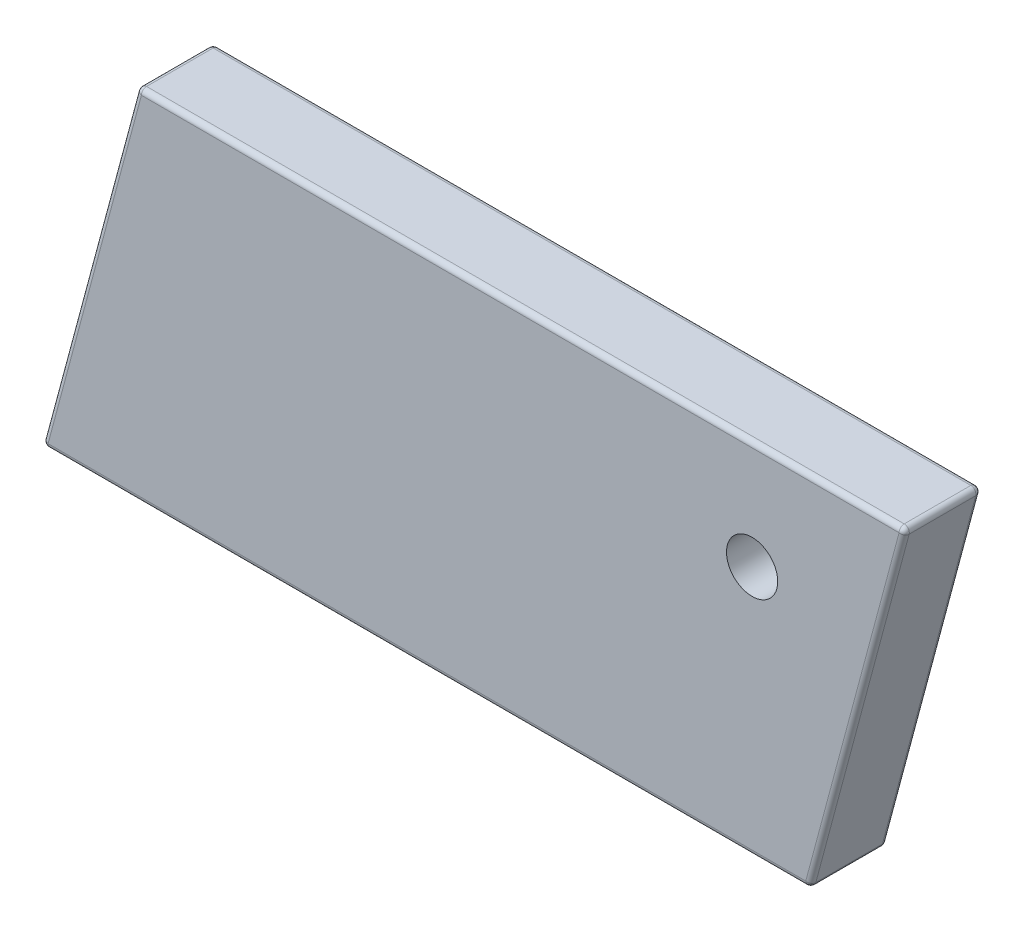
ISO-10303-21;
HEADER;
FILE_DESCRIPTION(('STEP AP214'),'2;1');
FILE_NAME('part.step','',(''),(''),'','','');
FILE_SCHEMA(('AUTOMOTIVE_DESIGN { 1 0 10303 214 1 1 1 1 }'));
ENDSEC;
DATA;
#1=APPLICATION_CONTEXT('core data for automotive mechanical design processes');
#2=APPLICATION_PROTOCOL_DEFINITION('international standard','automotive_design',2000,#1);
#3=PRODUCT_CONTEXT('',#1,'mechanical');
#4=PRODUCT('Part','Part','',(#3));
#5=PRODUCT_RELATED_PRODUCT_CATEGORY('part','',(#4));
#6=PRODUCT_DEFINITION_FORMATION('','',#4);
#7=PRODUCT_DEFINITION_CONTEXT('part definition',#1,'design');
#8=PRODUCT_DEFINITION('design','',#6,#7);
#9=PRODUCT_DEFINITION_SHAPE('','',#8);
#10=(LENGTH_UNIT() NAMED_UNIT(*) SI_UNIT(.MILLI.,.METRE.));
#11=(NAMED_UNIT(*) PLANE_ANGLE_UNIT() SI_UNIT($,.RADIAN.));
#12=(NAMED_UNIT(*) SI_UNIT($,.STERADIAN.) SOLID_ANGLE_UNIT());
#13=UNCERTAINTY_MEASURE_WITH_UNIT(LENGTH_MEASURE(1.E-05),#10,'distance_accuracy_value','');
#14=(GEOMETRIC_REPRESENTATION_CONTEXT(3) GLOBAL_UNCERTAINTY_ASSIGNED_CONTEXT((#13)) GLOBAL_UNIT_ASSIGNED_CONTEXT((#10,
#11,#12)) REPRESENTATION_CONTEXT('',''));
#15=CARTESIAN_POINT('',(0.,0.,0.));
#16=DIRECTION('',(0.,0.,1.));
#17=DIRECTION('',(1.,0.,0.));
#18=AXIS2_PLACEMENT_3D('',#15,#16,#17);
#19=CARTESIAN_POINT('',(190.5,0.,19.05));
#20=DIRECTION('',(0.,1.,0.));
#21=DIRECTION('',(0.,0.,1.));
#22=AXIS2_PLACEMENT_3D('',#19,#20,#21);
#23=PLANE('',#22);
#24=DIRECTION('',(1.,0.,0.));
#25=VECTOR('',#24,1.);
#26=CARTESIAN_POINT('',(190.5,0.,1.27));
#27=LINE('',#26,#25);
#28=CARTESIAN_POINT('',(1.65509622350835,0.,1.27));
#29=VERTEX_POINT('',#28);
#30=CARTESIAN_POINT('',(189.525494725267,0.,1.27));
#31=VERTEX_POINT('',#30);
#32=EDGE_CURVE('E250',#29,#31,#27,.T.);
#33=ORIENTED_EDGE('',*,*,#32,.T.);
#34=DIRECTION('',(0.,0.,-1.));
#35=VECTOR('',#34,1.);
#36=CARTESIAN_POINT('',(189.525494725267,0.,19.05));
#37=LINE('',#36,#35);
#38=CARTESIAN_POINT('',(189.525494725267,0.,17.78));
#39=VERTEX_POINT('',#38);
#40=EDGE_CURVE('E257',#31,#39,#37,.F.);
#41=ORIENTED_EDGE('',*,*,#40,.T.);
#42=DIRECTION('',(1.,0.,0.));
#43=VECTOR('',#42,1.);
#44=CARTESIAN_POINT('',(190.5,0.,17.78));
#45=LINE('',#44,#43);
#46=CARTESIAN_POINT('',(1.65509622350835,0.,17.78));
#47=VERTEX_POINT('',#46);
#48=EDGE_CURVE('E253',#39,#47,#45,.F.);
#49=ORIENTED_EDGE('',*,*,#48,.T.);
#50=DIRECTION('',(0.,0.,-1.));
#51=VECTOR('',#50,1.);
#52=CARTESIAN_POINT('',(1.65509622350835,0.,19.05));
#53=LINE('',#52,#51);
#54=EDGE_CURVE('E247',#47,#29,#53,.T.);
#55=ORIENTED_EDGE('',*,*,#54,.T.);
#56=EDGE_LOOP('',(#33,#41,#49,#55));
#57=FACE_BOUND('',#56,.T.);
#58=ADVANCED_FACE('F39',(#57),#23,.F.);
#59=CARTESIAN_POINT('',(214.320683207127,88.9,19.05));
#60=DIRECTION('',(-0.965925826289067,0.258819045102524,0.));
#61=DIRECTION('',(-0.258819045102524,-0.965925826289068,0.));
#62=AXIS2_PLACEMENT_3D('',#59,#60,#61);
#63=PLANE('',#62);
#64=DIRECTION('',(0.258819045102524,0.965925826289068,0.));
#65=VECTOR('',#64,1.);
#66=CARTESIAN_POINT('',(214.320683207127,88.9,17.78));
#67=LINE('',#66,#65);
#68=CARTESIAN_POINT('',(213.892312783006,87.3012998127198,17.78));
#69=VERTEX_POINT('',#68);
#70=CARTESIAN_POINT('',(190.752220524654,0.941299812719789,17.78));
#71=VERTEX_POINT('',#70);
#72=EDGE_CURVE('E165',#69,#71,#67,.F.);
#73=ORIENTED_EDGE('',*,*,#72,.T.);
#74=DIRECTION('',(0.,0.,-1.));
#75=VECTOR('',#74,1.);
#76=CARTESIAN_POINT('',(190.752220524654,0.941299812719787,19.05));
#77=LINE('',#76,#75);
#78=CARTESIAN_POINT('',(190.752220524654,0.941299812719789,1.27));
#79=VERTEX_POINT('',#78);
#80=EDGE_CURVE('E281',#71,#79,#77,.T.);
#81=ORIENTED_EDGE('',*,*,#80,.T.);
#82=DIRECTION('',(0.258819045102524,0.965925826289068,0.));
#83=VECTOR('',#82,1.);
#84=CARTESIAN_POINT('',(214.320683207127,88.9,1.27));
#85=LINE('',#84,#83);
#86=CARTESIAN_POINT('',(213.892312783006,87.3012998127198,1.27));
#87=VERTEX_POINT('',#86);
#88=EDGE_CURVE('E273',#79,#87,#85,.T.);
#89=ORIENTED_EDGE('',*,*,#88,.T.);
#90=DIRECTION('',(0.,0.,-1.));
#91=VECTOR('',#90,1.);
#92=CARTESIAN_POINT('',(213.892312783006,87.3012998127198,19.05));
#93=LINE('',#92,#91);
#94=EDGE_CURVE('E276',#87,#69,#93,.F.);
#95=ORIENTED_EDGE('',*,*,#94,.T.);
#96=EDGE_LOOP('',(#73,#81,#89,#95));
#97=FACE_BOUND('',#96,.T.);
#98=ADVANCED_FACE('F348',(#97),#63,.F.);
#99=CARTESIAN_POINT('',(23.8206832071271,88.9,19.05));
#100=DIRECTION('',(0.,-1.,0.));
#101=DIRECTION('',(1.,0.,0.));
#102=AXIS2_PLACEMENT_3D('',#99,#100,#101);
#103=PLANE('',#102);
#104=DIRECTION('',(0.,0.,-1.));
#105=VECTOR('',#104,1.);
#106=CARTESIAN_POINT('',(212.665586983619,88.9,19.05));
#107=LINE('',#106,#105);
#108=CARTESIAN_POINT('',(212.665586983619,88.9,17.78));
#109=VERTEX_POINT('',#108);
#110=CARTESIAN_POINT('',(212.665586983619,88.9,1.27));
#111=VERTEX_POINT('',#110);
#112=EDGE_CURVE('E291',#109,#111,#107,.T.);
#113=ORIENTED_EDGE('',*,*,#112,.T.);
#114=DIRECTION('',(-1.,0.,0.));
#115=VECTOR('',#114,1.);
#116=CARTESIAN_POINT('',(23.8206832071271,88.9,1.27));
#117=LINE('',#116,#115);
#118=CARTESIAN_POINT('',(24.7951884818604,88.9,1.27));
#119=VERTEX_POINT('',#118);
#120=EDGE_CURVE('E295',#111,#119,#117,.T.);
#121=ORIENTED_EDGE('',*,*,#120,.T.);
#122=DIRECTION('',(0.,0.,-1.));
#123=VECTOR('',#122,1.);
#124=CARTESIAN_POINT('',(24.7951884818604,88.9,19.05));
#125=LINE('',#124,#123);
#126=CARTESIAN_POINT('',(24.7951884818604,88.9,17.78));
#127=VERTEX_POINT('',#126);
#128=EDGE_CURVE('E288',#119,#127,#125,.F.);
#129=ORIENTED_EDGE('',*,*,#128,.T.);
#130=DIRECTION('',(-1.,0.,0.));
#131=VECTOR('',#130,1.);
#132=CARTESIAN_POINT('',(23.8206832071271,88.9,17.78));
#133=LINE('',#132,#131);
#134=EDGE_CURVE('E285',#127,#109,#133,.F.);
#135=ORIENTED_EDGE('',*,*,#134,.T.);
#136=EDGE_LOOP('',(#113,#121,#129,#135));
#137=FACE_BOUND('',#136,.T.);
#138=ADVANCED_FACE('F355',(#137),#103,.F.);
#139=CARTESIAN_POINT('',(0.,0.,19.05));
#140=DIRECTION('',(0.965925826289067,-0.258819045102524,0.));
#141=DIRECTION('',(0.258819045102524,0.965925826289068,0.));
#142=AXIS2_PLACEMENT_3D('',#139,#140,#141);
#143=PLANE('',#142);
#144=DIRECTION('',(-0.258819045102524,-0.965925826289068,0.));
#145=VECTOR('',#144,1.);
#146=CARTESIAN_POINT('',(0.,0.,17.78));
#147=LINE('',#146,#145);
#148=CARTESIAN_POINT('',(0.428370424121223,1.59870018728021,17.78));
#149=VERTEX_POINT('',#148);
#150=CARTESIAN_POINT('',(23.5684626824733,87.9587001872802,17.78));
#151=VERTEX_POINT('',#150);
#152=EDGE_CURVE('E49',#149,#151,#147,.F.);
#153=ORIENTED_EDGE('',*,*,#152,.T.);
#154=DIRECTION('',(0.,0.,-1.));
#155=VECTOR('',#154,1.);
#156=CARTESIAN_POINT('',(23.5684626824733,87.9587001872802,19.05));
#157=LINE('',#156,#155);
#158=CARTESIAN_POINT('',(23.5684626824733,87.9587001872802,1.27));
#159=VERTEX_POINT('',#158);
#160=EDGE_CURVE('E11',#151,#159,#157,.T.);
#161=ORIENTED_EDGE('',*,*,#160,.T.);
#162=DIRECTION('',(-0.258819045102524,-0.965925826289068,0.));
#163=VECTOR('',#162,1.);
#164=CARTESIAN_POINT('',(0.,0.,1.27));
#165=LINE('',#164,#163);
#166=CARTESIAN_POINT('',(0.428370424121223,1.59870018728021,1.27));
#167=VERTEX_POINT('',#166);
#168=EDGE_CURVE('E298',#159,#167,#165,.T.);
#169=ORIENTED_EDGE('',*,*,#168,.T.);
#170=DIRECTION('',(0.,0.,-1.));
#171=VECTOR('',#170,1.);
#172=CARTESIAN_POINT('',(0.428370424121223,1.59870018728021,19.05));
#173=LINE('',#172,#171);
#174=EDGE_CURVE('E60',#167,#149,#173,.F.);
#175=ORIENTED_EDGE('',*,*,#174,.T.);
#176=EDGE_LOOP('',(#153,#161,#169,#175));
#177=FACE_BOUND('',#176,.T.);
#178=ADVANCED_FACE('F553',(#177),#143,.F.);
#179=CARTESIAN_POINT('',(0.,0.,19.05));
#180=DIRECTION('',(0.,0.,-1.));
#181=DIRECTION('',(-1.,0.,0.));
#182=AXIS2_PLACEMENT_3D('',#179,#180,#181);
#183=PLANE('',#182);
#184=DIRECTION('',(-0.258819045102524,-0.965925826289068,0.));
#185=VECTOR('',#184,1.);
#186=CARTESIAN_POINT('',(1.22672579938712,-0.328700187280206,19.05));
#187=LINE('',#186,#185);
#188=CARTESIAN_POINT('',(24.7951884818604,87.63,19.05));
#189=VERTEX_POINT('',#188);
#190=CARTESIAN_POINT('',(1.65509622350834,1.27,19.05));
#191=VERTEX_POINT('',#190);
#192=EDGE_CURVE('E140',#189,#191,#187,.T.);
#193=ORIENTED_EDGE('',*,*,#192,.T.);
#194=DIRECTION('',(1.,0.,0.));
#195=VECTOR('',#194,1.);
#196=CARTESIAN_POINT('',(0.,1.27,19.05));
#197=LINE('',#196,#195);
#198=CARTESIAN_POINT('',(189.525494725267,1.27,19.05));
#199=VERTEX_POINT('',#198);
#200=EDGE_CURVE('E135',#191,#199,#197,.T.);
#201=ORIENTED_EDGE('',*,*,#200,.T.);
#202=DIRECTION('',(0.258819045102524,0.965925826289068,0.));
#203=VECTOR('',#202,1.);
#204=CARTESIAN_POINT('',(176.51219391108,-47.2962998127204,19.05));
#205=LINE('',#204,#203);
#206=CARTESIAN_POINT('',(212.665586983619,87.63,19.05));
#207=VERTEX_POINT('',#206);
#208=EDGE_CURVE('E128',#199,#207,#205,.T.);
#209=ORIENTED_EDGE('',*,*,#208,.T.);
#210=DIRECTION('',(-1.,0.,0.));
#211=VECTOR('',#210,1.);
#212=CARTESIAN_POINT('',(0.,87.63,19.05));
#213=LINE('',#212,#211);
#214=EDGE_CURVE('E132',#207,#189,#213,.T.);
#215=ORIENTED_EDGE('',*,*,#214,.T.);
#216=EDGE_LOOP('',(#193,#201,#209,#215));
#217=FACE_BOUND('',#216,.T.);
#218=CARTESIAN_POINT('',(176.220683207127,62.0837890126232,19.05));
#219=DIRECTION('',(0.,0.,1.));
#220=DIRECTION('',(1.,0.,0.));
#221=AXIS2_PLACEMENT_3D('',#218,#219,#220);
#222=CIRCLE('',#221,6.34999999999999);
#223=CARTESIAN_POINT('',(182.570683207127,62.0837890126232,19.05));
#224=VERTEX_POINT('',#223);
#225=EDGE_CURVE('E229',#224,#224,#222,.T.);
#226=ORIENTED_EDGE('',*,*,#225,.F.);
#227=EDGE_LOOP('',(#226));
#228=FACE_BOUND('',#227,.T.);
#229=ADVANCED_FACE('F130',(#217,#228),#183,.F.);
#230=CARTESIAN_POINT('',(0.,0.,0.));
#231=DIRECTION('',(0.,0.,-1.));
#232=DIRECTION('',(-1.,0.,0.));
#233=AXIS2_PLACEMENT_3D('',#230,#231,#232);
#234=PLANE('',#233);
#235=DIRECTION('',(0.258819045102524,0.965925826289068,0.));
#236=VECTOR('',#235,1.);
#237=CARTESIAN_POINT('',(189.273274200613,0.328700187280165,0.));
#238=LINE('',#237,#236);
#239=CARTESIAN_POINT('',(212.665586983619,87.63,0.));
#240=VERTEX_POINT('',#239);
#241=CARTESIAN_POINT('',(189.525494725267,1.27,0.));
#242=VERTEX_POINT('',#241);
#243=EDGE_CURVE('E266',#240,#242,#238,.F.);
#244=ORIENTED_EDGE('',*,*,#243,.T.);
#245=DIRECTION('',(1.,0.,0.));
#246=VECTOR('',#245,1.);
#247=CARTESIAN_POINT('',(0.,1.27,0.));
#248=LINE('',#247,#246);
#249=CARTESIAN_POINT('',(1.65509622350834,1.27,0.));
#250=VERTEX_POINT('',#249);
#251=EDGE_CURVE('E269',#242,#250,#248,.F.);
#252=ORIENTED_EDGE('',*,*,#251,.T.);
#253=DIRECTION('',(-0.258819045102524,-0.965925826289068,0.));
#254=VECTOR('',#253,1.);
#255=CARTESIAN_POINT('',(25.0474090065143,88.5712998127198,0.));
#256=LINE('',#255,#254);
#257=CARTESIAN_POINT('',(24.7951884818604,87.63,0.));
#258=VERTEX_POINT('',#257);
#259=EDGE_CURVE('E263',#250,#258,#256,.F.);
#260=ORIENTED_EDGE('',*,*,#259,.T.);
#261=DIRECTION('',(-1.,0.,0.));
#262=VECTOR('',#261,1.);
#263=CARTESIAN_POINT('',(214.320683207127,87.63,0.));
#264=LINE('',#263,#262);
#265=EDGE_CURVE('E260',#258,#240,#264,.F.);
#266=ORIENTED_EDGE('',*,*,#265,.T.);
#267=EDGE_LOOP('',(#244,#252,#260,#266));
#268=FACE_BOUND('',#267,.T.);
#269=CARTESIAN_POINT('',(176.220683207127,62.0837890126232,0.));
#270=DIRECTION('',(0.,0.,1.));
#271=DIRECTION('',(1.,0.,0.));
#272=AXIS2_PLACEMENT_3D('',#269,#270,#271);
#273=CIRCLE('',#272,6.34999999999999);
#274=CARTESIAN_POINT('',(182.570683207127,62.0837890126232,0.));
#275=VERTEX_POINT('',#274);
#276=EDGE_CURVE('E153',#275,#275,#273,.T.);
#277=ORIENTED_EDGE('',*,*,#276,.T.);
#278=EDGE_LOOP('',(#277));
#279=FACE_BOUND('',#278,.T.);
#280=ADVANCED_FACE('F537',(#268,#279),#234,.T.);
#281=CARTESIAN_POINT('',(176.220683207127,62.0837890126232,0.));
#282=DIRECTION('',(0.,0.,1.));
#283=DIRECTION('',(1.,0.,0.));
#284=AXIS2_PLACEMENT_3D('',#281,#282,#283);
#285=CYLINDRICAL_SURFACE('',#284,6.34999999999999);
#286=CARTESIAN_POINT('',(182.570683207127,62.0837890126232,0.));
#287=CARTESIAN_POINT('',(182.570683207127,62.0837890126232,0.1984375));
#288=CARTESIAN_POINT('',(182.570683207127,62.0837890126232,0.396875));
#289=CARTESIAN_POINT('',(182.570683207127,62.0837890126232,0.79375));
#290=CARTESIAN_POINT('',(182.570683207127,62.0837890126232,0.9921875));
#291=CARTESIAN_POINT('',(182.570683207127,62.0837890126232,1.3890625));
#292=CARTESIAN_POINT('',(182.570683207127,62.0837890126232,1.5875));
#293=CARTESIAN_POINT('',(182.570683207127,62.0837890126232,1.984375));
#294=CARTESIAN_POINT('',(182.570683207127,62.0837890126232,2.1828125));
#295=CARTESIAN_POINT('',(182.570683207127,62.0837890126232,2.5796875));
#296=CARTESIAN_POINT('',(182.570683207127,62.0837890126232,2.778125));
#297=CARTESIAN_POINT('',(182.570683207127,62.0837890126232,3.175));
#298=CARTESIAN_POINT('',(182.570683207127,62.0837890126232,3.3734375));
#299=CARTESIAN_POINT('',(182.570683207127,62.0837890126232,3.7703125));
#300=CARTESIAN_POINT('',(182.570683207127,62.0837890126232,3.96875));
#301=CARTESIAN_POINT('',(182.570683207127,62.0837890126232,4.365625));
#302=CARTESIAN_POINT('',(182.570683207127,62.0837890126232,4.5640625));
#303=CARTESIAN_POINT('',(182.570683207127,62.0837890126232,4.9609375));
#304=CARTESIAN_POINT('',(182.570683207127,62.0837890126232,5.159375));
#305=CARTESIAN_POINT('',(182.570683207127,62.0837890126232,5.55625));
#306=CARTESIAN_POINT('',(182.570683207127,62.0837890126232,5.7546875));
#307=CARTESIAN_POINT('',(182.570683207127,62.0837890126232,6.1515625));
#308=CARTESIAN_POINT('',(182.570683207127,62.0837890126232,6.35));
#309=CARTESIAN_POINT('',(182.570683207127,62.0837890126232,6.746875));
#310=CARTESIAN_POINT('',(182.570683207127,62.0837890126232,6.9453125));
#311=CARTESIAN_POINT('',(182.570683207127,62.0837890126232,7.3421875));
#312=CARTESIAN_POINT('',(182.570683207127,62.0837890126232,7.540625));
#313=CARTESIAN_POINT('',(182.570683207127,62.0837890126232,7.9375));
#314=CARTESIAN_POINT('',(182.570683207127,62.0837890126232,8.1359375));
#315=CARTESIAN_POINT('',(182.570683207127,62.0837890126232,8.5328125));
#316=CARTESIAN_POINT('',(182.570683207127,62.0837890126232,8.73125));
#317=CARTESIAN_POINT('',(182.570683207127,62.0837890126232,9.128125));
#318=CARTESIAN_POINT('',(182.570683207127,62.0837890126232,9.3265625));
#319=CARTESIAN_POINT('',(182.570683207127,62.0837890126232,9.7234375));
#320=CARTESIAN_POINT('',(182.570683207127,62.0837890126232,9.921875));
#321=CARTESIAN_POINT('',(182.570683207127,62.0837890126232,10.31875));
#322=CARTESIAN_POINT('',(182.570683207127,62.0837890126232,10.5171875));
#323=CARTESIAN_POINT('',(182.570683207127,62.0837890126232,10.9140625));
#324=CARTESIAN_POINT('',(182.570683207127,62.0837890126232,11.1125));
#325=CARTESIAN_POINT('',(182.570683207127,62.0837890126232,11.509375));
#326=CARTESIAN_POINT('',(182.570683207127,62.0837890126232,11.7078125));
#327=CARTESIAN_POINT('',(182.570683207127,62.0837890126232,12.1046875));
#328=CARTESIAN_POINT('',(182.570683207127,62.0837890126232,12.303125));
#329=CARTESIAN_POINT('',(182.570683207127,62.0837890126232,12.7));
#330=CARTESIAN_POINT('',(182.570683207127,62.0837890126232,12.8984375));
#331=CARTESIAN_POINT('',(182.570683207127,62.0837890126232,13.2953125));
#332=CARTESIAN_POINT('',(182.570683207127,62.0837890126232,13.49375));
#333=CARTESIAN_POINT('',(182.570683207127,62.0837890126232,13.890625));
#334=CARTESIAN_POINT('',(182.570683207127,62.0837890126232,14.0890625));
#335=CARTESIAN_POINT('',(182.570683207127,62.0837890126232,14.4859375));
#336=CARTESIAN_POINT('',(182.570683207127,62.0837890126232,14.684375));
#337=CARTESIAN_POINT('',(182.570683207127,62.0837890126232,15.08125));
#338=CARTESIAN_POINT('',(182.570683207127,62.0837890126232,15.2796875));
#339=CARTESIAN_POINT('',(182.570683207127,62.0837890126232,15.6765625));
#340=CARTESIAN_POINT('',(182.570683207127,62.0837890126232,15.875));
#341=CARTESIAN_POINT('',(182.570683207127,62.0837890126232,16.271875));
#342=CARTESIAN_POINT('',(182.570683207127,62.0837890126232,16.4703125));
#343=CARTESIAN_POINT('',(182.570683207127,62.0837890126232,16.8671875));
#344=CARTESIAN_POINT('',(182.570683207127,62.0837890126232,17.065625));
#345=CARTESIAN_POINT('',(182.570683207127,62.0837890126232,17.4625));
#346=CARTESIAN_POINT('',(182.570683207127,62.0837890126232,17.6609375));
#347=CARTESIAN_POINT('',(182.570683207127,62.0837890126232,18.0578125));
#348=CARTESIAN_POINT('',(182.570683207127,62.0837890126232,18.25625));
#349=CARTESIAN_POINT('',(182.570683207127,62.0837890126232,18.653125));
#350=CARTESIAN_POINT('',(182.570683207127,62.0837890126232,18.8515625));
#351=CARTESIAN_POINT('',(182.570683207127,62.0837890126232,19.05));
#352=B_SPLINE_CURVE_WITH_KNOTS('',3,(#286,#287,#288,#289,#290,#291,#292,#293,#294,#295,#296,
#297,#298,#299,#300,#301,#302,#303,#304,#305,#306,#307,#308,#309,#310,#311,#312,#313,#314,#315,
#316,#317,#318,#319,#320,#321,#322,#323,#324,#325,#326,#327,#328,#329,#330,#331,#332,#333,#334,
#335,#336,#337,#338,#339,#340,#341,#342,#343,#344,#345,#346,#347,#348,#349,#350,#351),
.UNSPECIFIED.,.F.,.F.,(4,2,2,2,2,2,2,2,2,2,2,2,2,2,2,2,2,2,2,2,2,2,2,2,2,2,2,2,2,2,2,2,4),(0.,
0.5953125,1.190625,1.7859375,2.38125,2.9765625,3.571875,4.1671875,4.7625,5.3578125,5.953125,
6.5484375,7.14375,7.7390625,8.334375,8.9296875,9.525,10.1203125,10.715625,11.3109375,11.90625,
12.5015625,13.096875,13.6921875,14.2875,14.8828125,15.478125,16.0734375,16.66875,17.2640625,
17.859375,18.4546875,19.05),.UNSPECIFIED.);
#353=EDGE_CURVE('BSEAM528',#275,#224,#352,.T.);
#354=ORIENTED_EDGE('',*,*,#276,.F.);
#355=ORIENTED_EDGE('',*,*,#225,.T.);
#356=ORIENTED_EDGE('',*,*,#353,.T.);
#357=ORIENTED_EDGE('',*,*,#353,.F.);
#358=EDGE_LOOP('',(#354,#356,#355,#357));
#359=FACE_BOUND('',#358,.T.);
#360=ADVANCED_FACE('F528',(#359),#285,.F.);
#361=CARTESIAN_POINT('',(23.8206832071271,87.63,1.27));
#362=DIRECTION('',(1.,0.,0.));
#363=DIRECTION('',(0.,1.,0.));
#364=AXIS2_PLACEMENT_3D('',#361,#362,#363);
#365=CYLINDRICAL_SURFACE('',#364,1.27);
#366=CARTESIAN_POINT('',(24.7951884818604,87.63,1.27));
#367=DIRECTION('',(-1.,0.,0.));
#368=DIRECTION('',(0.,0.,1.));
#369=AXIS2_PLACEMENT_3D('',#366,#367,#368);
#370=CIRCLE('',#369,1.27);
#371=EDGE_CURVE('E43',#119,#258,#370,.T.);
#372=ORIENTED_EDGE('',*,*,#371,.F.);
#373=ORIENTED_EDGE('',*,*,#120,.F.);
#374=CARTESIAN_POINT('',(212.665586983619,87.63,1.27));
#375=DIRECTION('',(1.,0.,0.));
#376=DIRECTION('',(0.,1.,0.));
#377=AXIS2_PLACEMENT_3D('',#374,#375,#376);
#378=CIRCLE('',#377,1.27);
#379=EDGE_CURVE('E219',#240,#111,#378,.T.);
#380=ORIENTED_EDGE('',*,*,#379,.F.);
#381=ORIENTED_EDGE('',*,*,#265,.F.);
#382=EDGE_LOOP('',(#372,#373,#380,#381));
#383=FACE_BOUND('',#382,.T.);
#384=ADVANCED_FACE('F41',(#383),#365,.T.);
#385=CARTESIAN_POINT('',(24.7951884818604,87.63,1.27));
#386=DIRECTION('',(0.,0.,1.));
#387=DIRECTION('',(1.,0.,0.));
#388=AXIS2_PLACEMENT_3D('',#385,#386,#387);
#389=SPHERICAL_SURFACE('',#388,1.27);
#390=CARTESIAN_POINT('',(24.7951884818604,87.63,1.27));
#391=DIRECTION('',(0.,0.,-1.));
#392=DIRECTION('',(-1.,0.,0.));
#393=AXIS2_PLACEMENT_3D('',#390,#391,#392);
#394=CIRCLE('',#393,1.27);
#395=EDGE_CURVE('E212',#119,#159,#394,.F.);
#396=ORIENTED_EDGE('',*,*,#395,.F.);
#397=ORIENTED_EDGE('',*,*,#371,.T.);
#398=CARTESIAN_POINT('',(24.7951884818604,87.63,1.27));
#399=DIRECTION('',(0.258819045102535,0.965925826289064,0.));
#400=DIRECTION('',(-0.965925826289064,0.258819045102535,0.));
#401=AXIS2_PLACEMENT_3D('',#398,#399,#400);
#402=CIRCLE('',#401,1.27);
#403=EDGE_CURVE('E216',#159,#258,#402,.F.);
#404=ORIENTED_EDGE('',*,*,#403,.F.);
#405=EDGE_LOOP('',(#396,#397,#404));
#406=FACE_BOUND('',#405,.T.);
#407=ADVANCED_FACE('F514',(#406),#389,.T.);
#408=CARTESIAN_POINT('',(212.665586983619,87.63,1.27));
#409=DIRECTION('',(0.,0.,1.));
#410=DIRECTION('',(1.,0.,0.));
#411=AXIS2_PLACEMENT_3D('',#408,#409,#410);
#412=SPHERICAL_SURFACE('',#411,1.27);
#413=CARTESIAN_POINT('',(212.665586983619,87.63,1.27));
#414=DIRECTION('',(0.258819045102523,0.965925826289068,0.));
#415=DIRECTION('',(-0.965925826289068,0.258819045102523,0.));
#416=AXIS2_PLACEMENT_3D('',#413,#414,#415);
#417=CIRCLE('',#416,1.27);
#418=EDGE_CURVE('E205',#240,#87,#417,.F.);
#419=ORIENTED_EDGE('',*,*,#418,.F.);
#420=ORIENTED_EDGE('',*,*,#379,.T.);
#421=CARTESIAN_POINT('',(212.665586983619,87.63,1.27));
#422=DIRECTION('',(0.,0.,-1.));
#423=DIRECTION('',(-1.,0.,0.));
#424=AXIS2_PLACEMENT_3D('',#421,#422,#423);
#425=CIRCLE('',#424,1.27);
#426=EDGE_CURVE('E209',#87,#111,#425,.F.);
#427=ORIENTED_EDGE('',*,*,#426,.F.);
#428=EDGE_LOOP('',(#419,#420,#427));
#429=FACE_BOUND('',#428,.T.);
#430=ADVANCED_FACE('F505',(#429),#412,.T.);
#431=CARTESIAN_POINT('',(1.22672579938712,-0.328700187280206,1.27));
#432=DIRECTION('',(0.258819045102524,0.965925826289068,0.));
#433=DIRECTION('',(-0.965925826289067,0.258819045102524,0.));
#434=AXIS2_PLACEMENT_3D('',#431,#432,#433);
#435=CYLINDRICAL_SURFACE('',#434,1.27);
#436=ORIENTED_EDGE('',*,*,#403,.T.);
#437=ORIENTED_EDGE('',*,*,#259,.F.);
#438=CARTESIAN_POINT('',(1.65509622350834,1.27,1.27));
#439=DIRECTION('',(-0.258819045102524,-0.965925826289067,0.));
#440=DIRECTION('',(0.965925826289067,-0.258819045102524,0.));
#441=AXIS2_PLACEMENT_3D('',#438,#439,#440);
#442=CIRCLE('',#441,1.27);
#443=EDGE_CURVE('E198',#167,#250,#442,.T.);
#444=ORIENTED_EDGE('',*,*,#443,.F.);
#445=ORIENTED_EDGE('',*,*,#168,.F.);
#446=EDGE_LOOP('',(#436,#437,#444,#445));
#447=FACE_BOUND('',#446,.T.);
#448=ADVANCED_FACE('F497',(#447),#435,.T.);
#449=CARTESIAN_POINT('',(24.7951884818604,87.63,19.05));
#450=DIRECTION('',(0.,0.,-1.));
#451=DIRECTION('',(-1.,0.,0.));
#452=AXIS2_PLACEMENT_3D('',#449,#450,#451);
#453=CYLINDRICAL_SURFACE('',#452,1.27);
#454=ORIENTED_EDGE('',*,*,#395,.T.);
#455=ORIENTED_EDGE('',*,*,#160,.F.);
#456=CARTESIAN_POINT('',(24.7951884818604,87.63,17.78));
#457=DIRECTION('',(0.,0.,1.));
#458=DIRECTION('',(1.,0.,0.));
#459=AXIS2_PLACEMENT_3D('',#456,#457,#458);
#460=CIRCLE('',#459,1.27);
#461=EDGE_CURVE('E194',#127,#151,#460,.T.);
#462=ORIENTED_EDGE('',*,*,#461,.F.);
#463=ORIENTED_EDGE('',*,*,#128,.F.);
#464=EDGE_LOOP('',(#454,#455,#462,#463));
#465=FACE_BOUND('',#464,.T.);
#466=ADVANCED_FACE('F359',(#465),#453,.T.);
#467=CARTESIAN_POINT('',(0.,87.63,17.78));
#468=DIRECTION('',(-1.,0.,0.));
#469=DIRECTION('',(0.,-1.,0.));
#470=AXIS2_PLACEMENT_3D('',#467,#468,#469);
#471=CYLINDRICAL_SURFACE('',#470,1.27);
#472=CARTESIAN_POINT('',(212.665586983619,87.63,17.78));
#473=DIRECTION('',(1.,0.,0.));
#474=DIRECTION('',(0.,0.,-1.));
#475=AXIS2_PLACEMENT_3D('',#472,#473,#474);
#476=CIRCLE('',#475,1.27);
#477=EDGE_CURVE('E147',#109,#207,#476,.T.);
#478=ORIENTED_EDGE('',*,*,#477,.F.);
#479=ORIENTED_EDGE('',*,*,#134,.F.);
#480=CARTESIAN_POINT('',(24.7951884818604,87.63,17.78));
#481=DIRECTION('',(-1.,0.,0.));
#482=DIRECTION('',(0.,-1.,0.));
#483=AXIS2_PLACEMENT_3D('',#480,#481,#482);
#484=CIRCLE('',#483,1.27);
#485=EDGE_CURVE('E150',#189,#127,#484,.T.);
#486=ORIENTED_EDGE('',*,*,#485,.F.);
#487=ORIENTED_EDGE('',*,*,#214,.F.);
#488=EDGE_LOOP('',(#478,#479,#486,#487));
#489=FACE_BOUND('',#488,.T.);
#490=ADVANCED_FACE('F145',(#489),#471,.T.);
#491=CARTESIAN_POINT('',(212.665586983619,87.63,19.05));
#492=DIRECTION('',(0.,0.,-1.));
#493=DIRECTION('',(-1.,0.,0.));
#494=AXIS2_PLACEMENT_3D('',#491,#492,#493);
#495=CYLINDRICAL_SURFACE('',#494,1.27);
#496=ORIENTED_EDGE('',*,*,#426,.T.);
#497=ORIENTED_EDGE('',*,*,#112,.F.);
#498=CARTESIAN_POINT('',(212.665586983619,87.63,17.78));
#499=DIRECTION('',(0.,0.,1.));
#500=DIRECTION('',(1.,0.,0.));
#501=AXIS2_PLACEMENT_3D('',#498,#499,#500);
#502=CIRCLE('',#501,1.27);
#503=EDGE_CURVE('E161',#69,#109,#502,.T.);
#504=ORIENTED_EDGE('',*,*,#503,.F.);
#505=ORIENTED_EDGE('',*,*,#94,.F.);
#506=EDGE_LOOP('',(#496,#497,#504,#505));
#507=FACE_BOUND('',#506,.T.);
#508=ADVANCED_FACE('F353',(#507),#495,.T.);
#509=CARTESIAN_POINT('',(213.09395740774,89.2287001872802,1.27));
#510=DIRECTION('',(-0.258819045102524,-0.965925826289068,0.));
#511=DIRECTION('',(0.965925826289067,-0.258819045102524,0.));
#512=AXIS2_PLACEMENT_3D('',#509,#510,#511);
#513=CYLINDRICAL_SURFACE('',#512,1.27);
#514=ORIENTED_EDGE('',*,*,#418,.T.);
#515=ORIENTED_EDGE('',*,*,#88,.F.);
#516=CARTESIAN_POINT('',(189.525494725267,1.27,1.27));
#517=DIRECTION('',(-0.258819045102525,-0.965925826289067,0.));
#518=DIRECTION('',(0.965925826289067,-0.258819045102525,0.));
#519=AXIS2_PLACEMENT_3D('',#516,#517,#518);
#520=CIRCLE('',#519,1.27);
#521=EDGE_CURVE('E186',#242,#79,#520,.T.);
#522=ORIENTED_EDGE('',*,*,#521,.F.);
#523=ORIENTED_EDGE('',*,*,#243,.F.);
#524=EDGE_LOOP('',(#514,#515,#522,#523));
#525=FACE_BOUND('',#524,.T.);
#526=ADVANCED_FACE('F466',(#525),#513,.T.);
#527=CARTESIAN_POINT('',(190.5,1.27,1.27));
#528=DIRECTION('',(-1.,0.,0.));
#529=DIRECTION('',(0.,0.,1.));
#530=AXIS2_PLACEMENT_3D('',#527,#528,#529);
#531=CYLINDRICAL_SURFACE('',#530,1.27);
#532=CARTESIAN_POINT('',(1.65509622350834,1.27,1.27));
#533=DIRECTION('',(-1.,0.,0.));
#534=DIRECTION('',(0.,-1.,0.));
#535=AXIS2_PLACEMENT_3D('',#532,#533,#534);
#536=CIRCLE('',#535,1.27);
#537=EDGE_CURVE('E201',#250,#29,#536,.T.);
#538=ORIENTED_EDGE('',*,*,#537,.F.);
#539=ORIENTED_EDGE('',*,*,#251,.F.);
#540=CARTESIAN_POINT('',(189.525494725267,1.27,1.27));
#541=DIRECTION('',(1.,0.,0.));
#542=DIRECTION('',(0.,0.,-1.));
#543=AXIS2_PLACEMENT_3D('',#540,#541,#542);
#544=CIRCLE('',#543,1.27);
#545=EDGE_CURVE('E182',#31,#242,#544,.T.);
#546=ORIENTED_EDGE('',*,*,#545,.F.);
#547=ORIENTED_EDGE('',*,*,#32,.F.);
#548=EDGE_LOOP('',(#538,#539,#546,#547));
#549=FACE_BOUND('',#548,.T.);
#550=ADVANCED_FACE('F457',(#549),#531,.T.);
#551=CARTESIAN_POINT('',(1.65509622350834,1.27,1.27));
#552=DIRECTION('',(0.,0.,1.));
#553=DIRECTION('',(1.,0.,0.));
#554=AXIS2_PLACEMENT_3D('',#551,#552,#553);
#555=SPHERICAL_SURFACE('',#554,1.27);
#556=ORIENTED_EDGE('',*,*,#443,.T.);
#557=ORIENTED_EDGE('',*,*,#537,.T.);
#558=CARTESIAN_POINT('',(1.65509622350835,1.27,1.27));
#559=DIRECTION('',(0.,0.,-1.));
#560=DIRECTION('',(-1.,0.,0.));
#561=AXIS2_PLACEMENT_3D('',#558,#559,#560);
#562=CIRCLE('',#561,1.27);
#563=EDGE_CURVE('E173',#167,#29,#562,.F.);
#564=ORIENTED_EDGE('',*,*,#563,.F.);
#565=EDGE_LOOP('',(#556,#557,#564));
#566=FACE_BOUND('',#565,.T.);
#567=ADVANCED_FACE('F449',(#566),#555,.T.);
#568=CARTESIAN_POINT('',(24.7951884818604,87.63,17.78));
#569=DIRECTION('',(0.,0.,1.));
#570=DIRECTION('',(1.,0.,0.));
#571=AXIS2_PLACEMENT_3D('',#568,#569,#570);
#572=SPHERICAL_SURFACE('',#571,1.27);
#573=ORIENTED_EDGE('',*,*,#485,.T.);
#574=ORIENTED_EDGE('',*,*,#461,.T.);
#575=CARTESIAN_POINT('',(24.7951884818604,87.63,17.78));
#576=DIRECTION('',(0.258819045102524,0.965925826289067,0.));
#577=DIRECTION('',(-0.965925826289067,0.258819045102524,0.));
#578=AXIS2_PLACEMENT_3D('',#575,#576,#577);
#579=CIRCLE('',#578,1.27);
#580=EDGE_CURVE('E167',#189,#151,#579,.F.);
#581=ORIENTED_EDGE('',*,*,#580,.F.);
#582=EDGE_LOOP('',(#573,#574,#581));
#583=FACE_BOUND('',#582,.T.);
#584=ADVANCED_FACE('F361',(#583),#572,.T.);
#585=CARTESIAN_POINT('',(212.665586983619,87.63,17.78));
#586=DIRECTION('',(0.,0.,1.));
#587=DIRECTION('',(1.,0.,0.));
#588=AXIS2_PLACEMENT_3D('',#585,#586,#587);
#589=SPHERICAL_SURFACE('',#588,1.27);
#590=ORIENTED_EDGE('',*,*,#503,.T.);
#591=ORIENTED_EDGE('',*,*,#477,.T.);
#592=CARTESIAN_POINT('',(212.665586983619,87.63,17.78));
#593=DIRECTION('',(0.258819045102518,0.965925826289069,0.));
#594=DIRECTION('',(-0.965925826289069,0.258819045102518,0.));
#595=AXIS2_PLACEMENT_3D('',#592,#593,#594);
#596=CIRCLE('',#595,1.27);
#597=EDGE_CURVE('E158',#69,#207,#596,.F.);
#598=ORIENTED_EDGE('',*,*,#597,.F.);
#599=EDGE_LOOP('',(#590,#591,#598));
#600=FACE_BOUND('',#599,.T.);
#601=ADVANCED_FACE('F157',(#600),#589,.T.);
#602=CARTESIAN_POINT('',(189.525494725267,1.27,1.27));
#603=DIRECTION('',(0.,0.,1.));
#604=DIRECTION('',(1.,0.,0.));
#605=AXIS2_PLACEMENT_3D('',#602,#603,#604);
#606=SPHERICAL_SURFACE('',#605,1.27);
#607=ORIENTED_EDGE('',*,*,#545,.T.);
#608=ORIENTED_EDGE('',*,*,#521,.T.);
#609=CARTESIAN_POINT('',(189.525494725267,1.27,1.27));
#610=DIRECTION('',(0.,0.,-1.));
#611=DIRECTION('',(-1.,0.,0.));
#612=AXIS2_PLACEMENT_3D('',#609,#610,#611);
#613=CIRCLE('',#612,1.27);
#614=EDGE_CURVE('E168',#31,#79,#613,.F.);
#615=ORIENTED_EDGE('',*,*,#614,.F.);
#616=EDGE_LOOP('',(#607,#608,#615));
#617=FACE_BOUND('',#616,.T.);
#618=ADVANCED_FACE('F372',(#617),#606,.T.);
#619=CARTESIAN_POINT('',(1.65509622350835,1.27,19.05));
#620=DIRECTION('',(0.,0.,-1.));
#621=DIRECTION('',(-1.,0.,0.));
#622=AXIS2_PLACEMENT_3D('',#619,#620,#621);
#623=CYLINDRICAL_SURFACE('',#622,1.27);
#624=ORIENTED_EDGE('',*,*,#563,.T.);
#625=ORIENTED_EDGE('',*,*,#54,.F.);
#626=CARTESIAN_POINT('',(1.65509622350834,1.27,17.78));
#627=DIRECTION('',(0.,0.,1.));
#628=DIRECTION('',(1.,0.,0.));
#629=AXIS2_PLACEMENT_3D('',#626,#627,#628);
#630=CIRCLE('',#629,1.27);
#631=EDGE_CURVE('E175',#149,#47,#630,.T.);
#632=ORIENTED_EDGE('',*,*,#631,.F.);
#633=ORIENTED_EDGE('',*,*,#174,.F.);
#634=EDGE_LOOP('',(#624,#625,#632,#633));
#635=FACE_BOUND('',#634,.T.);
#636=ADVANCED_FACE('F331',(#635),#623,.T.);
#637=CARTESIAN_POINT('',(1.22672579938712,-0.328700187280206,17.78));
#638=DIRECTION('',(-0.258819045102524,-0.965925826289068,0.));
#639=DIRECTION('',(0.965925826289067,-0.258819045102524,0.));
#640=AXIS2_PLACEMENT_3D('',#637,#638,#639);
#641=CYLINDRICAL_SURFACE('',#640,1.27);
#642=ORIENTED_EDGE('',*,*,#580,.T.);
#643=ORIENTED_EDGE('',*,*,#152,.F.);
#644=CARTESIAN_POINT('',(1.65509622350834,1.27,17.78));
#645=DIRECTION('',(-0.258819045102526,-0.965925826289067,0.));
#646=DIRECTION('',(0.965925826289067,-0.258819045102526,0.));
#647=AXIS2_PLACEMENT_3D('',#644,#645,#646);
#648=CIRCLE('',#647,1.27);
#649=EDGE_CURVE('E319',#191,#149,#648,.T.);
#650=ORIENTED_EDGE('',*,*,#649,.F.);
#651=ORIENTED_EDGE('',*,*,#192,.F.);
#652=EDGE_LOOP('',(#642,#643,#650,#651));
#653=FACE_BOUND('',#652,.T.);
#654=ADVANCED_FACE('F364',(#653),#641,.T.);
#655=CARTESIAN_POINT('',(176.51219391108,-47.2962998127204,17.78));
#656=DIRECTION('',(0.258819045102524,0.965925826289068,0.));
#657=DIRECTION('',(-0.965925826289067,0.258819045102524,0.));
#658=AXIS2_PLACEMENT_3D('',#655,#656,#657);
#659=CYLINDRICAL_SURFACE('',#658,1.27);
#660=ORIENTED_EDGE('',*,*,#597,.T.);
#661=ORIENTED_EDGE('',*,*,#208,.F.);
#662=CARTESIAN_POINT('',(189.525494725267,1.27,17.78));
#663=DIRECTION('',(-0.258819045102523,-0.965925826289068,0.));
#664=DIRECTION('',(0.965925826289068,-0.258819045102523,0.));
#665=AXIS2_PLACEMENT_3D('',#662,#663,#664);
#666=CIRCLE('',#665,1.27);
#667=EDGE_CURVE('E315',#71,#199,#666,.T.);
#668=ORIENTED_EDGE('',*,*,#667,.F.);
#669=ORIENTED_EDGE('',*,*,#72,.F.);
#670=EDGE_LOOP('',(#660,#661,#668,#669));
#671=FACE_BOUND('',#670,.T.);
#672=ADVANCED_FACE('F164',(#671),#659,.T.);
#673=CARTESIAN_POINT('',(189.525494725267,1.26999999999999,19.05));
#674=DIRECTION('',(0.,0.,-1.));
#675=DIRECTION('',(-1.,0.,0.));
#676=AXIS2_PLACEMENT_3D('',#673,#674,#675);
#677=CYLINDRICAL_SURFACE('',#676,1.27);
#678=ORIENTED_EDGE('',*,*,#614,.T.);
#679=ORIENTED_EDGE('',*,*,#80,.F.);
#680=CARTESIAN_POINT('',(189.525494725267,1.27,17.78));
#681=DIRECTION('',(0.,0.,1.));
#682=DIRECTION('',(1.,0.,0.));
#683=AXIS2_PLACEMENT_3D('',#680,#681,#682);
#684=CIRCLE('',#683,1.27);
#685=EDGE_CURVE('E311',#39,#71,#684,.T.);
#686=ORIENTED_EDGE('',*,*,#685,.F.);
#687=ORIENTED_EDGE('',*,*,#40,.F.);
#688=EDGE_LOOP('',(#678,#679,#686,#687));
#689=FACE_BOUND('',#688,.T.);
#690=ADVANCED_FACE('F345',(#689),#677,.T.);
#691=CARTESIAN_POINT('',(1.65509622350834,1.27,17.78));
#692=DIRECTION('',(0.,0.,1.));
#693=DIRECTION('',(1.,0.,0.));
#694=AXIS2_PLACEMENT_3D('',#691,#692,#693);
#695=SPHERICAL_SURFACE('',#694,1.27);
#696=ORIENTED_EDGE('',*,*,#649,.T.);
#697=ORIENTED_EDGE('',*,*,#631,.T.);
#698=CARTESIAN_POINT('',(1.65509622350835,1.27,17.78));
#699=DIRECTION('',(-1.,0.,0.));
#700=DIRECTION('',(0.,0.,1.));
#701=AXIS2_PLACEMENT_3D('',#698,#699,#700);
#702=CIRCLE('',#701,1.27);
#703=EDGE_CURVE('E308',#191,#47,#702,.F.);
#704=ORIENTED_EDGE('',*,*,#703,.F.);
#705=EDGE_LOOP('',(#696,#697,#704));
#706=FACE_BOUND('',#705,.T.);
#707=ADVANCED_FACE('F328',(#706),#695,.T.);
#708=CARTESIAN_POINT('',(189.525494725267,1.27,17.78));
#709=DIRECTION('',(0.,0.,1.));
#710=DIRECTION('',(1.,0.,0.));
#711=AXIS2_PLACEMENT_3D('',#708,#709,#710);
#712=SPHERICAL_SURFACE('',#711,1.27);
#713=ORIENTED_EDGE('',*,*,#685,.T.);
#714=ORIENTED_EDGE('',*,*,#667,.T.);
#715=CARTESIAN_POINT('',(189.525494725267,1.27,17.78));
#716=DIRECTION('',(1.,0.,0.));
#717=DIRECTION('',(0.,1.,0.));
#718=AXIS2_PLACEMENT_3D('',#715,#716,#717);
#719=CIRCLE('',#718,1.27);
#720=EDGE_CURVE('E305',#39,#199,#719,.F.);
#721=ORIENTED_EDGE('',*,*,#720,.F.);
#722=EDGE_LOOP('',(#713,#714,#721));
#723=FACE_BOUND('',#722,.T.);
#724=ADVANCED_FACE('F342',(#723),#712,.T.);
#725=CARTESIAN_POINT('',(0.,1.27,17.78));
#726=DIRECTION('',(1.,0.,0.));
#727=DIRECTION('',(0.,0.,-1.));
#728=AXIS2_PLACEMENT_3D('',#725,#726,#727);
#729=CYLINDRICAL_SURFACE('',#728,1.27);
#730=ORIENTED_EDGE('',*,*,#703,.T.);
#731=ORIENTED_EDGE('',*,*,#48,.F.);
#732=ORIENTED_EDGE('',*,*,#720,.T.);
#733=ORIENTED_EDGE('',*,*,#200,.F.);
#734=EDGE_LOOP('',(#730,#731,#732,#733));
#735=FACE_BOUND('',#734,.T.);
#736=ADVANCED_FACE('F340',(#735),#729,.T.);
#737=CLOSED_SHELL('',(#58,#98,#138,#178,#229,#280,#360,#384,#407,#430,#448,#466,#490,#508,#526,
#550,#567,#584,#601,#618,#636,#654,#672,#690,#707,#724,#736));
#738=MANIFOLD_SOLID_BREP('B2',#737);
#739=ADVANCED_BREP_SHAPE_REPRESENTATION('',(#18,#738),#14);
#740=SHAPE_DEFINITION_REPRESENTATION(#9,#739);
ENDSEC;
END-ISO-10303-21;
